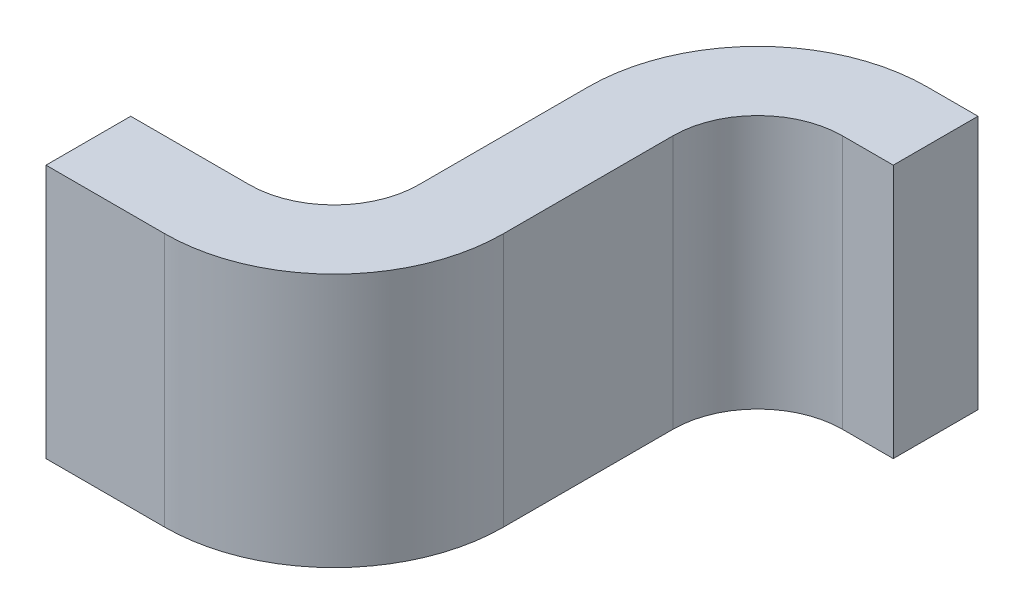
ISO-10303-21;
HEADER;
FILE_DESCRIPTION(('STEP AP214'),'2;1');
FILE_NAME('part.step','',(''),(''),'','','');
FILE_SCHEMA(('AUTOMOTIVE_DESIGN { 1 0 10303 214 1 1 1 1 }'));
ENDSEC;
DATA;
#1=APPLICATION_CONTEXT('core data for automotive mechanical design processes');
#2=APPLICATION_PROTOCOL_DEFINITION('international standard','automotive_design',2000,#1);
#3=PRODUCT_CONTEXT('',#1,'mechanical');
#4=PRODUCT('Part','Part','',(#3));
#5=PRODUCT_RELATED_PRODUCT_CATEGORY('part','',(#4));
#6=PRODUCT_DEFINITION_FORMATION('','',#4);
#7=PRODUCT_DEFINITION_CONTEXT('part definition',#1,'design');
#8=PRODUCT_DEFINITION('design','',#6,#7);
#9=PRODUCT_DEFINITION_SHAPE('','',#8);
#10=(LENGTH_UNIT() NAMED_UNIT(*) SI_UNIT(.MILLI.,.METRE.));
#11=(NAMED_UNIT(*) PLANE_ANGLE_UNIT() SI_UNIT($,.RADIAN.));
#12=(NAMED_UNIT(*) SI_UNIT($,.STERADIAN.) SOLID_ANGLE_UNIT());
#13=UNCERTAINTY_MEASURE_WITH_UNIT(LENGTH_MEASURE(1.E-05),#10,'distance_accuracy_value','');
#14=(GEOMETRIC_REPRESENTATION_CONTEXT(3) GLOBAL_UNCERTAINTY_ASSIGNED_CONTEXT((#13)) GLOBAL_UNIT_ASSIGNED_CONTEXT((#10,
#11,#12)) REPRESENTATION_CONTEXT('',''));
#15=CARTESIAN_POINT('',(0.,0.,0.));
#16=DIRECTION('',(0.,0.,1.));
#17=DIRECTION('',(1.,0.,0.));
#18=AXIS2_PLACEMENT_3D('',#15,#16,#17);
#19=CARTESIAN_POINT('',(0.,0.15,0.6));
#20=DIRECTION('',(0.,0.,-1.));
#21=DIRECTION('',(-1.,0.,0.));
#22=AXIS2_PLACEMENT_3D('',#19,#20,#21);
#23=PLANE('',#22);
#24=DIRECTION('',(1.,0.,0.));
#25=VECTOR('',#24,1.);
#26=CARTESIAN_POINT('',(0.,0.15,0.6));
#27=LINE('',#26,#25);
#28=CARTESIAN_POINT('',(0.14,0.15,0.6));
#29=VERTEX_POINT('',#28);
#30=CARTESIAN_POINT('',(0.,0.15,0.6));
#31=VERTEX_POINT('',#30);
#32=EDGE_CURVE('E192',#29,#31,#27,.F.);
#33=ORIENTED_EDGE('',*,*,#32,.T.);
#34=DIRECTION('',(0.,1.,0.));
#35=VECTOR('',#34,1.);
#36=CARTESIAN_POINT('',(0.,-0.15,0.6));
#37=LINE('',#36,#35);
#38=CARTESIAN_POINT('',(0.,-0.15,0.6));
#39=VERTEX_POINT('',#38);
#40=EDGE_CURVE('E94',#39,#31,#37,.T.);
#41=ORIENTED_EDGE('',*,*,#40,.F.);
#42=DIRECTION('',(1.,0.,0.));
#43=VECTOR('',#42,1.);
#44=CARTESIAN_POINT('',(0.,-0.15,0.6));
#45=LINE('',#44,#43);
#46=CARTESIAN_POINT('',(0.14,-0.15,0.6));
#47=VERTEX_POINT('',#46);
#48=EDGE_CURVE('E175',#39,#47,#45,.T.);
#49=ORIENTED_EDGE('',*,*,#48,.T.);
#50=DIRECTION('',(0.,1.,0.));
#51=VECTOR('',#50,1.);
#52=CARTESIAN_POINT('',(0.14,0.15,0.6));
#53=LINE('',#52,#51);
#54=EDGE_CURVE('E86',#29,#47,#53,.F.);
#55=ORIENTED_EDGE('',*,*,#54,.F.);
#56=EDGE_LOOP('',(#33,#41,#49,#55));
#57=FACE_BOUND('',#56,.T.);
#58=ADVANCED_FACE('F17',(#57),#23,.F.);
#59=CARTESIAN_POINT('',(0.,-0.15,0.5));
#60=DIRECTION('',(-1.,0.,0.));
#61=DIRECTION('',(0.,0.,1.));
#62=AXIS2_PLACEMENT_3D('',#59,#60,#61);
#63=PLANE('',#62);
#64=DIRECTION('',(0.,0.,1.));
#65=VECTOR('',#64,1.);
#66=CARTESIAN_POINT('',(0.,0.15,0.5));
#67=LINE('',#66,#65);
#68=CARTESIAN_POINT('',(0.,0.15,0.5));
#69=VERTEX_POINT('',#68);
#70=EDGE_CURVE('E182',#31,#69,#67,.F.);
#71=ORIENTED_EDGE('',*,*,#70,.T.);
#72=DIRECTION('',(0.,1.,0.));
#73=VECTOR('',#72,1.);
#74=CARTESIAN_POINT('',(0.,-0.15,0.5));
#75=LINE('',#74,#73);
#76=CARTESIAN_POINT('',(0.,-0.15,0.5));
#77=VERTEX_POINT('',#76);
#78=EDGE_CURVE('E165',#69,#77,#75,.F.);
#79=ORIENTED_EDGE('',*,*,#78,.T.);
#80=DIRECTION('',(0.,0.,1.));
#81=VECTOR('',#80,1.);
#82=CARTESIAN_POINT('',(0.,-0.15,0.6));
#83=LINE('',#82,#81);
#84=EDGE_CURVE('E177',#77,#39,#83,.T.);
#85=ORIENTED_EDGE('',*,*,#84,.T.);
#86=ORIENTED_EDGE('',*,*,#40,.T.);
#87=EDGE_LOOP('',(#71,#79,#85,#86));
#88=FACE_BOUND('',#87,.T.);
#89=ADVANCED_FACE('F227',(#88),#63,.T.);
#90=CARTESIAN_POINT('',(0.14,0.15,0.4));
#91=DIRECTION('',(0.,1.,0.));
#92=DIRECTION('',(0.,0.,1.));
#93=AXIS2_PLACEMENT_3D('',#90,#91,#92);
#94=CYLINDRICAL_SURFACE('',#93,0.2);
#95=CARTESIAN_POINT('',(0.14,0.15,0.4));
#96=DIRECTION('',(0.,1.,0.));
#97=DIRECTION('',(0.,0.,1.));
#98=AXIS2_PLACEMENT_3D('',#95,#96,#97);
#99=CIRCLE('',#98,0.2);
#100=CARTESIAN_POINT('',(0.34,0.15,0.4));
#101=VERTEX_POINT('',#100);
#102=EDGE_CURVE('E20',#29,#101,#99,.T.);
#103=ORIENTED_EDGE('',*,*,#102,.F.);
#104=ORIENTED_EDGE('',*,*,#54,.T.);
#105=CARTESIAN_POINT('',(0.14,-0.15,0.4));
#106=DIRECTION('',(0.,1.,0.));
#107=DIRECTION('',(0.,0.,1.));
#108=AXIS2_PLACEMENT_3D('',#105,#106,#107);
#109=CIRCLE('',#108,0.2);
#110=CARTESIAN_POINT('',(0.34,-0.15,0.4));
#111=VERTEX_POINT('',#110);
#112=EDGE_CURVE('E158',#111,#47,#109,.F.);
#113=ORIENTED_EDGE('',*,*,#112,.F.);
#114=DIRECTION('',(0.,1.,0.));
#115=VECTOR('',#114,1.);
#116=CARTESIAN_POINT('',(0.34,0.15,0.4));
#117=LINE('',#116,#115);
#118=EDGE_CURVE('E153',#111,#101,#117,.T.);
#119=ORIENTED_EDGE('',*,*,#118,.T.);
#120=EDGE_LOOP('',(#103,#104,#113,#119));
#121=FACE_BOUND('',#120,.T.);
#122=ADVANCED_FACE('F215',(#121),#94,.T.);
#123=CARTESIAN_POINT('',(0.44,0.15,0.1));
#124=DIRECTION('',(0.,0.,-1.));
#125=DIRECTION('',(-1.,0.,0.));
#126=AXIS2_PLACEMENT_3D('',#123,#124,#125);
#127=PLANE('',#126);
#128=DIRECTION('',(1.,0.,0.));
#129=VECTOR('',#128,1.);
#130=CARTESIAN_POINT('',(0.44,0.15,0.1));
#131=LINE('',#130,#129);
#132=CARTESIAN_POINT('',(0.5,0.15,0.1));
#133=VERTEX_POINT('',#132);
#134=CARTESIAN_POINT('',(0.44,0.15,0.1));
#135=VERTEX_POINT('',#134);
#136=EDGE_CURVE('E151',#133,#135,#131,.F.);
#137=ORIENTED_EDGE('',*,*,#136,.T.);
#138=DIRECTION('',(0.,-1.,0.));
#139=VECTOR('',#138,1.);
#140=CARTESIAN_POINT('',(0.44,0.15,0.1));
#141=LINE('',#140,#139);
#142=CARTESIAN_POINT('',(0.44,-0.15,0.1));
#143=VERTEX_POINT('',#142);
#144=EDGE_CURVE('E150',#135,#143,#141,.T.);
#145=ORIENTED_EDGE('',*,*,#144,.T.);
#146=DIRECTION('',(1.,0.,0.));
#147=VECTOR('',#146,1.);
#148=CARTESIAN_POINT('',(0.44,-0.15,0.1));
#149=LINE('',#148,#147);
#150=CARTESIAN_POINT('',(0.5,-0.15,0.1));
#151=VERTEX_POINT('',#150);
#152=EDGE_CURVE('E121',#143,#151,#149,.T.);
#153=ORIENTED_EDGE('',*,*,#152,.T.);
#154=DIRECTION('',(0.,1.,0.));
#155=VECTOR('',#154,1.);
#156=CARTESIAN_POINT('',(0.5,-0.15,0.1));
#157=LINE('',#156,#155);
#158=EDGE_CURVE('E118',#151,#133,#157,.T.);
#159=ORIENTED_EDGE('',*,*,#158,.T.);
#160=EDGE_LOOP('',(#137,#145,#153,#159));
#161=FACE_BOUND('',#160,.T.);
#162=ADVANCED_FACE('F265',(#161),#127,.F.);
#163=CARTESIAN_POINT('',(0.,-0.15,0.5));
#164=DIRECTION('',(0.,0.,1.));
#165=DIRECTION('',(1.,0.,0.));
#166=AXIS2_PLACEMENT_3D('',#163,#164,#165);
#167=PLANE('',#166);
#168=DIRECTION('',(1.,0.,0.));
#169=VECTOR('',#168,1.);
#170=CARTESIAN_POINT('',(0.,-0.15,0.5));
#171=LINE('',#170,#169);
#172=CARTESIAN_POINT('',(0.14,-0.15,0.5));
#173=VERTEX_POINT('',#172);
#174=EDGE_CURVE('E163',#77,#173,#171,.T.);
#175=ORIENTED_EDGE('',*,*,#174,.F.);
#176=ORIENTED_EDGE('',*,*,#78,.F.);
#177=DIRECTION('',(1.,0.,0.));
#178=VECTOR('',#177,1.);
#179=CARTESIAN_POINT('',(0.,0.15,0.5));
#180=LINE('',#179,#178);
#181=CARTESIAN_POINT('',(0.14,0.15,0.5));
#182=VERTEX_POINT('',#181);
#183=EDGE_CURVE('E168',#182,#69,#180,.F.);
#184=ORIENTED_EDGE('',*,*,#183,.F.);
#185=DIRECTION('',(0.,1.,0.));
#186=VECTOR('',#185,1.);
#187=CARTESIAN_POINT('',(0.14,-0.15,0.5));
#188=LINE('',#187,#186);
#189=EDGE_CURVE('E159',#182,#173,#188,.F.);
#190=ORIENTED_EDGE('',*,*,#189,.T.);
#191=EDGE_LOOP('',(#175,#176,#184,#190));
#192=FACE_BOUND('',#191,.T.);
#193=ADVANCED_FACE('F262',(#192),#167,.F.);
#194=CARTESIAN_POINT('',(0.34,0.15,0.4));
#195=DIRECTION('',(-1.,0.,0.));
#196=DIRECTION('',(0.,0.,1.));
#197=AXIS2_PLACEMENT_3D('',#194,#195,#196);
#198=PLANE('',#197);
#199=DIRECTION('',(0.,0.,-1.));
#200=VECTOR('',#199,1.);
#201=CARTESIAN_POINT('',(0.34,0.15,0.4));
#202=LINE('',#201,#200);
#203=CARTESIAN_POINT('',(0.34,0.15,0.2));
#204=VERTEX_POINT('',#203);
#205=EDGE_CURVE('E146',#204,#101,#202,.F.);
#206=ORIENTED_EDGE('',*,*,#205,.T.);
#207=ORIENTED_EDGE('',*,*,#118,.F.);
#208=DIRECTION('',(0.,0.,1.));
#209=VECTOR('',#208,1.);
#210=CARTESIAN_POINT('',(0.34,-0.15,0.4));
#211=LINE('',#210,#209);
#212=CARTESIAN_POINT('',(0.34,-0.15,0.2));
#213=VERTEX_POINT('',#212);
#214=EDGE_CURVE('E207',#111,#213,#211,.F.);
#215=ORIENTED_EDGE('',*,*,#214,.T.);
#216=DIRECTION('',(0.,-1.,0.));
#217=VECTOR('',#216,1.);
#218=CARTESIAN_POINT('',(0.34,0.15,0.2));
#219=LINE('',#218,#217);
#220=EDGE_CURVE('E120',#213,#204,#219,.F.);
#221=ORIENTED_EDGE('',*,*,#220,.T.);
#222=EDGE_LOOP('',(#206,#207,#215,#221));
#223=FACE_BOUND('',#222,.T.);
#224=ADVANCED_FACE('F217',(#223),#198,.F.);
#225=CARTESIAN_POINT('',(0.5,-0.15,0.));
#226=DIRECTION('',(-1.,0.,0.));
#227=DIRECTION('',(0.,0.,1.));
#228=AXIS2_PLACEMENT_3D('',#225,#226,#227);
#229=PLANE('',#228);
#230=DIRECTION('',(0.,0.,1.));
#231=VECTOR('',#230,1.);
#232=CARTESIAN_POINT('',(0.5,0.15,0.));
#233=LINE('',#232,#231);
#234=CARTESIAN_POINT('',(0.5,0.15,0.));
#235=VERTEX_POINT('',#234);
#236=EDGE_CURVE('E142',#133,#235,#233,.F.);
#237=ORIENTED_EDGE('',*,*,#236,.F.);
#238=ORIENTED_EDGE('',*,*,#158,.F.);
#239=DIRECTION('',(0.,0.,1.));
#240=VECTOR('',#239,1.);
#241=CARTESIAN_POINT('',(0.5,-0.15,0.1));
#242=LINE('',#241,#240);
#243=CARTESIAN_POINT('',(0.5,-0.15,0.));
#244=VERTEX_POINT('',#243);
#245=EDGE_CURVE('E111',#151,#244,#242,.F.);
#246=ORIENTED_EDGE('',*,*,#245,.T.);
#247=DIRECTION('',(0.,1.,0.));
#248=VECTOR('',#247,1.);
#249=CARTESIAN_POINT('',(0.5,-0.15,0.));
#250=LINE('',#249,#248);
#251=EDGE_CURVE('E116',#244,#235,#250,.T.);
#252=ORIENTED_EDGE('',*,*,#251,.T.);
#253=EDGE_LOOP('',(#237,#238,#246,#252));
#254=FACE_BOUND('',#253,.T.);
#255=ADVANCED_FACE('F114',(#254),#229,.F.);
#256=CARTESIAN_POINT('',(0.44,0.15,0.2));
#257=DIRECTION('',(0.,-1.,0.));
#258=DIRECTION('',(0.,0.,-1.));
#259=AXIS2_PLACEMENT_3D('',#256,#257,#258);
#260=CYLINDRICAL_SURFACE('',#259,0.1);
#261=CARTESIAN_POINT('',(0.44,0.15,0.2));
#262=DIRECTION('',(0.,-1.,0.));
#263=DIRECTION('',(0.,0.,-1.));
#264=AXIS2_PLACEMENT_3D('',#261,#262,#263);
#265=CIRCLE('',#264,0.1);
#266=EDGE_CURVE('E204',#204,#135,#265,.T.);
#267=ORIENTED_EDGE('',*,*,#266,.F.);
#268=ORIENTED_EDGE('',*,*,#220,.F.);
#269=CARTESIAN_POINT('',(0.44,-0.15,0.2));
#270=DIRECTION('',(0.,-1.,0.));
#271=DIRECTION('',(0.,0.,-1.));
#272=AXIS2_PLACEMENT_3D('',#269,#270,#271);
#273=CIRCLE('',#272,0.1);
#274=EDGE_CURVE('E133',#143,#213,#273,.F.);
#275=ORIENTED_EDGE('',*,*,#274,.F.);
#276=ORIENTED_EDGE('',*,*,#144,.F.);
#277=EDGE_LOOP('',(#267,#268,#275,#276));
#278=FACE_BOUND('',#277,.T.);
#279=ADVANCED_FACE('F253',(#278),#260,.F.);
#280=CARTESIAN_POINT('',(0.14,-0.15,0.4));
#281=DIRECTION('',(0.,1.,0.));
#282=DIRECTION('',(0.,0.,1.));
#283=AXIS2_PLACEMENT_3D('',#280,#281,#282);
#284=CYLINDRICAL_SURFACE('',#283,0.1);
#285=CARTESIAN_POINT('',(0.14,-0.15,0.4));
#286=DIRECTION('',(0.,1.,0.));
#287=DIRECTION('',(0.,0.,1.));
#288=AXIS2_PLACEMENT_3D('',#285,#286,#287);
#289=CIRCLE('',#288,0.1);
#290=CARTESIAN_POINT('',(0.24,-0.15,0.4));
#291=VERTEX_POINT('',#290);
#292=EDGE_CURVE('E162',#173,#291,#289,.T.);
#293=ORIENTED_EDGE('',*,*,#292,.F.);
#294=ORIENTED_EDGE('',*,*,#189,.F.);
#295=CARTESIAN_POINT('',(0.14,0.15,0.4));
#296=DIRECTION('',(0.,1.,0.));
#297=DIRECTION('',(0.,0.,1.));
#298=AXIS2_PLACEMENT_3D('',#295,#296,#297);
#299=CIRCLE('',#298,0.1);
#300=CARTESIAN_POINT('',(0.24,0.15,0.4));
#301=VERTEX_POINT('',#300);
#302=EDGE_CURVE('E149',#301,#182,#299,.F.);
#303=ORIENTED_EDGE('',*,*,#302,.F.);
#304=DIRECTION('',(0.,1.,0.));
#305=VECTOR('',#304,1.);
#306=CARTESIAN_POINT('',(0.24,-0.15,0.4));
#307=LINE('',#306,#305);
#308=EDGE_CURVE('E368',#301,#291,#307,.F.);
#309=ORIENTED_EDGE('',*,*,#308,.T.);
#310=EDGE_LOOP('',(#293,#294,#303,#309));
#311=FACE_BOUND('',#310,.T.);
#312=ADVANCED_FACE('F250',(#311),#284,.F.);
#313=CARTESIAN_POINT('',(0.333933982822,0.15,0.09393398282202));
#314=DIRECTION('',(0.,1.,0.));
#315=DIRECTION('',(0.,0.,1.));
#316=AXIS2_PLACEMENT_3D('',#313,#314,#315);
#317=PLANE('',#316);
#318=CARTESIAN_POINT('',(0.44,0.15,0.2));
#319=DIRECTION('',(0.,-1.,0.));
#320=DIRECTION('',(0.,0.,-1.));
#321=AXIS2_PLACEMENT_3D('',#318,#319,#320);
#322=CIRCLE('',#321,0.2);
#323=CARTESIAN_POINT('',(0.24,0.15,0.2));
#324=VERTEX_POINT('',#323);
#325=CARTESIAN_POINT('',(0.44,0.15,0.));
#326=VERTEX_POINT('',#325);
#327=EDGE_CURVE('E201',#324,#326,#322,.T.);
#328=ORIENTED_EDGE('',*,*,#327,.F.);
#329=DIRECTION('',(0.,0.,-1.));
#330=VECTOR('',#329,1.);
#331=CARTESIAN_POINT('',(0.24,0.15,0.4));
#332=LINE('',#331,#330);
#333=EDGE_CURVE('E135',#324,#301,#332,.F.);
#334=ORIENTED_EDGE('',*,*,#333,.T.);
#335=ORIENTED_EDGE('',*,*,#302,.T.);
#336=ORIENTED_EDGE('',*,*,#183,.T.);
#337=ORIENTED_EDGE('',*,*,#70,.F.);
#338=ORIENTED_EDGE('',*,*,#32,.F.);
#339=ORIENTED_EDGE('',*,*,#102,.T.);
#340=ORIENTED_EDGE('',*,*,#205,.F.);
#341=ORIENTED_EDGE('',*,*,#266,.T.);
#342=ORIENTED_EDGE('',*,*,#136,.F.);
#343=ORIENTED_EDGE('',*,*,#236,.T.);
#344=DIRECTION('',(1.,0.,0.));
#345=VECTOR('',#344,1.);
#346=CARTESIAN_POINT('',(0.44,0.15,0.));
#347=LINE('',#346,#345);
#348=EDGE_CURVE('E130',#235,#326,#347,.F.);
#349=ORIENTED_EDGE('',*,*,#348,.T.);
#350=EDGE_LOOP('',(#328,#334,#335,#336,#337,#338,#339,#340,#341,#342,#343,#349));
#351=FACE_BOUND('',#350,.T.);
#352=ADVANCED_FACE('F224',(#351),#317,.T.);
#353=CARTESIAN_POINT('',(0.44,-0.15,0.));
#354=DIRECTION('',(0.,0.,1.));
#355=DIRECTION('',(1.,0.,0.));
#356=AXIS2_PLACEMENT_3D('',#353,#354,#355);
#357=PLANE('',#356);
#358=DIRECTION('',(1.,0.,0.));
#359=VECTOR('',#358,1.);
#360=CARTESIAN_POINT('',(0.44,-0.15,0.));
#361=LINE('',#360,#359);
#362=CARTESIAN_POINT('',(0.44,-0.15,0.));
#363=VERTEX_POINT('',#362);
#364=EDGE_CURVE('E123',#363,#244,#361,.T.);
#365=ORIENTED_EDGE('',*,*,#364,.F.);
#366=DIRECTION('',(0.,-1.,0.));
#367=VECTOR('',#366,1.);
#368=CARTESIAN_POINT('',(0.44,-0.15,0.));
#369=LINE('',#368,#367);
#370=EDGE_CURVE('E200',#326,#363,#369,.T.);
#371=ORIENTED_EDGE('',*,*,#370,.F.);
#372=ORIENTED_EDGE('',*,*,#348,.F.);
#373=ORIENTED_EDGE('',*,*,#251,.F.);
#374=EDGE_LOOP('',(#365,#371,#372,#373));
#375=FACE_BOUND('',#374,.T.);
#376=ADVANCED_FACE('F132',(#375),#357,.F.);
#377=CARTESIAN_POINT('',(0.333933982822,-0.15,0.09393398282202));
#378=DIRECTION('',(0.,-1.,0.));
#379=DIRECTION('',(0.,0.,-1.));
#380=AXIS2_PLACEMENT_3D('',#377,#378,#379);
#381=PLANE('',#380);
#382=ORIENTED_EDGE('',*,*,#274,.T.);
#383=ORIENTED_EDGE('',*,*,#214,.F.);
#384=ORIENTED_EDGE('',*,*,#112,.T.);
#385=ORIENTED_EDGE('',*,*,#48,.F.);
#386=ORIENTED_EDGE('',*,*,#84,.F.);
#387=ORIENTED_EDGE('',*,*,#174,.T.);
#388=ORIENTED_EDGE('',*,*,#292,.T.);
#389=DIRECTION('',(0.,0.,-1.));
#390=VECTOR('',#389,1.);
#391=CARTESIAN_POINT('',(0.24,-0.15,0.4));
#392=LINE('',#391,#390);
#393=CARTESIAN_POINT('',(0.24,-0.15,0.2));
#394=VERTEX_POINT('',#393);
#395=EDGE_CURVE('E35',#291,#394,#392,.T.);
#396=ORIENTED_EDGE('',*,*,#395,.T.);
#397=CARTESIAN_POINT('',(0.44,-0.15,0.2));
#398=DIRECTION('',(0.,-1.,0.));
#399=DIRECTION('',(0.,0.,-1.));
#400=AXIS2_PLACEMENT_3D('',#397,#398,#399);
#401=CIRCLE('',#400,0.2);
#402=EDGE_CURVE('E26',#363,#394,#401,.F.);
#403=ORIENTED_EDGE('',*,*,#402,.F.);
#404=ORIENTED_EDGE('',*,*,#364,.T.);
#405=ORIENTED_EDGE('',*,*,#245,.F.);
#406=ORIENTED_EDGE('',*,*,#152,.F.);
#407=EDGE_LOOP('',(#382,#383,#384,#385,#386,#387,#388,#396,#403,#404,#405,#406));
#408=FACE_BOUND('',#407,.T.);
#409=ADVANCED_FACE('F125',(#408),#381,.T.);
#410=CARTESIAN_POINT('',(0.24,-0.15,0.4));
#411=DIRECTION('',(1.,0.,0.));
#412=DIRECTION('',(0.,0.,-1.));
#413=AXIS2_PLACEMENT_3D('',#410,#411,#412);
#414=PLANE('',#413);
#415=ORIENTED_EDGE('',*,*,#395,.F.);
#416=ORIENTED_EDGE('',*,*,#308,.F.);
#417=ORIENTED_EDGE('',*,*,#333,.F.);
#418=DIRECTION('',(0.,-1.,0.));
#419=VECTOR('',#418,1.);
#420=CARTESIAN_POINT('',(0.24,-0.15,0.2));
#421=LINE('',#420,#419);
#422=EDGE_CURVE('E11',#394,#324,#421,.F.);
#423=ORIENTED_EDGE('',*,*,#422,.F.);
#424=EDGE_LOOP('',(#415,#416,#417,#423));
#425=FACE_BOUND('',#424,.T.);
#426=ADVANCED_FACE('F235',(#425),#414,.F.);
#427=CARTESIAN_POINT('',(0.44,-0.15,0.2));
#428=DIRECTION('',(0.,-1.,0.));
#429=DIRECTION('',(0.,0.,-1.));
#430=AXIS2_PLACEMENT_3D('',#427,#428,#429);
#431=CYLINDRICAL_SURFACE('',#430,0.2);
#432=ORIENTED_EDGE('',*,*,#402,.T.);
#433=ORIENTED_EDGE('',*,*,#422,.T.);
#434=ORIENTED_EDGE('',*,*,#327,.T.);
#435=ORIENTED_EDGE('',*,*,#370,.T.);
#436=EDGE_LOOP('',(#432,#433,#434,#435));
#437=FACE_BOUND('',#436,.T.);
#438=ADVANCED_FACE('F233',(#437),#431,.T.);
#439=CLOSED_SHELL('',(#58,#89,#122,#162,#193,#224,#255,#279,#312,#352,#376,#409,#426,#438));
#440=MANIFOLD_SOLID_BREP('B1',#439);
#441=ADVANCED_BREP_SHAPE_REPRESENTATION('',(#18,#440),#14);
#442=SHAPE_DEFINITION_REPRESENTATION(#9,#441);
ENDSEC;
END-ISO-10303-21;
